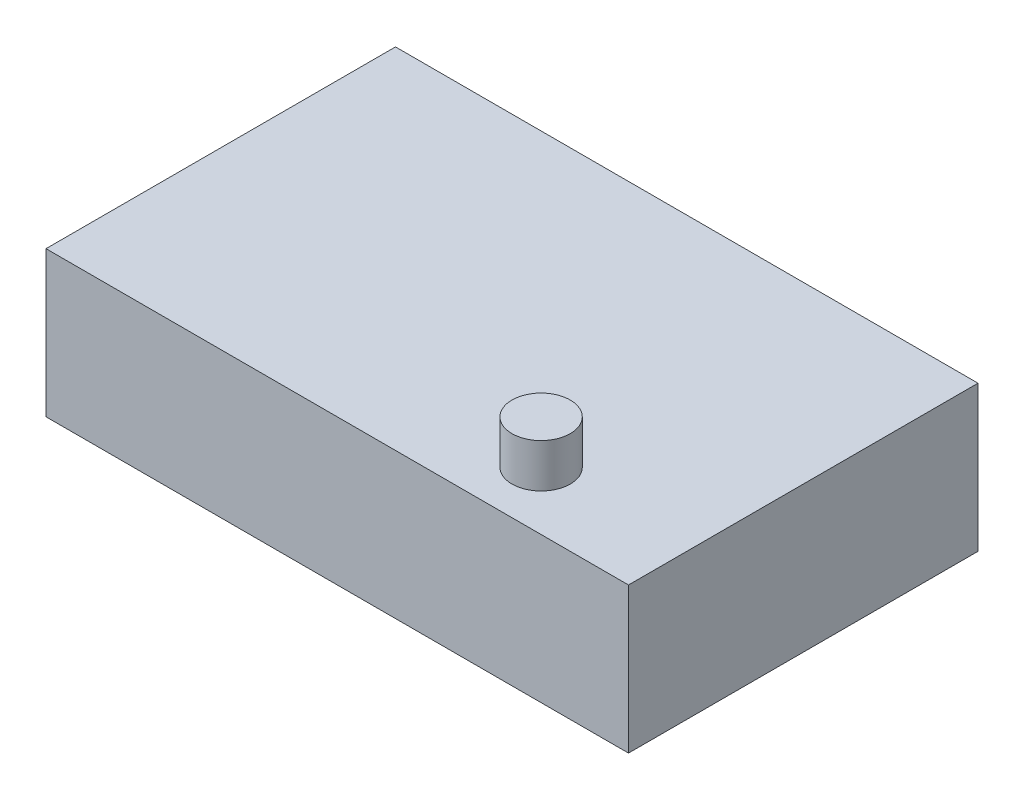
ISO-10303-21;
HEADER;
FILE_DESCRIPTION(('STEP AP214'),'2;1');
FILE_NAME('part.step','',(''),(''),'','','');
FILE_SCHEMA(('AUTOMOTIVE_DESIGN { 1 0 10303 214 1 1 1 1 }'));
ENDSEC;
DATA;
#1=APPLICATION_CONTEXT('core data for automotive mechanical design processes');
#2=APPLICATION_PROTOCOL_DEFINITION('international standard','automotive_design',2000,#1);
#3=PRODUCT_CONTEXT('',#1,'mechanical');
#4=PRODUCT('Part','Part','',(#3));
#5=PRODUCT_RELATED_PRODUCT_CATEGORY('part','',(#4));
#6=PRODUCT_DEFINITION_FORMATION('','',#4);
#7=PRODUCT_DEFINITION_CONTEXT('part definition',#1,'design');
#8=PRODUCT_DEFINITION('design','',#6,#7);
#9=PRODUCT_DEFINITION_SHAPE('','',#8);
#10=(LENGTH_UNIT() NAMED_UNIT(*) SI_UNIT(.MILLI.,.METRE.));
#11=(NAMED_UNIT(*) PLANE_ANGLE_UNIT() SI_UNIT($,.RADIAN.));
#12=(NAMED_UNIT(*) SI_UNIT($,.STERADIAN.) SOLID_ANGLE_UNIT());
#13=UNCERTAINTY_MEASURE_WITH_UNIT(LENGTH_MEASURE(1.E-05),#10,'distance_accuracy_value','');
#14=(GEOMETRIC_REPRESENTATION_CONTEXT(3) GLOBAL_UNCERTAINTY_ASSIGNED_CONTEXT((#13)) GLOBAL_UNIT_ASSIGNED_CONTEXT((#10,
#11,#12)) REPRESENTATION_CONTEXT('',''));
#15=CARTESIAN_POINT('',(0.,0.,0.));
#16=DIRECTION('',(0.,0.,1.));
#17=DIRECTION('',(1.,0.,0.));
#18=AXIS2_PLACEMENT_3D('',#15,#16,#17);
#19=CARTESIAN_POINT('',(-10.,5.,6.));
#20=DIRECTION('',(1.,0.,0.));
#21=DIRECTION('',(0.,0.,-1.));
#22=AXIS2_PLACEMENT_3D('',#19,#20,#21);
#23=PLANE('',#22);
#24=DIRECTION('',(0.,0.,1.));
#25=VECTOR('',#24,1.);
#26=CARTESIAN_POINT('',(-10.,0.,6.));
#27=LINE('',#26,#25);
#28=CARTESIAN_POINT('',(-10.,0.,-6.));
#29=VERTEX_POINT('',#28);
#30=CARTESIAN_POINT('',(-10.,0.,6.));
#31=VERTEX_POINT('',#30);
#32=EDGE_CURVE('E97',#29,#31,#27,.T.);
#33=ORIENTED_EDGE('',*,*,#32,.T.);
#34=DIRECTION('',(0.,-1.,0.));
#35=VECTOR('',#34,1.);
#36=CARTESIAN_POINT('',(-10.,5.,6.));
#37=LINE('',#36,#35);
#38=CARTESIAN_POINT('',(-10.,5.,6.));
#39=VERTEX_POINT('',#38);
#40=EDGE_CURVE('E11',#39,#31,#37,.T.);
#41=ORIENTED_EDGE('',*,*,#40,.F.);
#42=DIRECTION('',(0.,0.,1.));
#43=VECTOR('',#42,1.);
#44=CARTESIAN_POINT('',(-10.,5.,6.));
#45=LINE('',#44,#43);
#46=CARTESIAN_POINT('',(-10.,5.,-6.));
#47=VERTEX_POINT('',#46);
#48=EDGE_CURVE('E85',#47,#39,#45,.T.);
#49=ORIENTED_EDGE('',*,*,#48,.F.);
#50=DIRECTION('',(0.,-1.,0.));
#51=VECTOR('',#50,1.);
#52=CARTESIAN_POINT('',(-10.,5.,-6.));
#53=LINE('',#52,#51);
#54=EDGE_CURVE('E93',#47,#29,#53,.T.);
#55=ORIENTED_EDGE('',*,*,#54,.T.);
#56=EDGE_LOOP('',(#33,#41,#49,#55));
#57=FACE_BOUND('',#56,.T.);
#58=ADVANCED_FACE('F34',(#57),#23,.F.);
#59=CARTESIAN_POINT('',(10.,5.,6.));
#60=DIRECTION('',(0.,0.,-1.));
#61=DIRECTION('',(-1.,0.,0.));
#62=AXIS2_PLACEMENT_3D('',#59,#60,#61);
#63=PLANE('',#62);
#64=DIRECTION('',(1.,0.,0.));
#65=VECTOR('',#64,1.);
#66=CARTESIAN_POINT('',(10.,0.,6.));
#67=LINE('',#66,#65);
#68=CARTESIAN_POINT('',(10.,0.,6.));
#69=VERTEX_POINT('',#68);
#70=EDGE_CURVE('E89',#31,#69,#67,.T.);
#71=ORIENTED_EDGE('',*,*,#70,.T.);
#72=DIRECTION('',(0.,-1.,0.));
#73=VECTOR('',#72,1.);
#74=CARTESIAN_POINT('',(10.,5.,6.));
#75=LINE('',#74,#73);
#76=CARTESIAN_POINT('',(10.,5.,6.));
#77=VERTEX_POINT('',#76);
#78=EDGE_CURVE('E42',#77,#69,#75,.T.);
#79=ORIENTED_EDGE('',*,*,#78,.F.);
#80=DIRECTION('',(1.,0.,0.));
#81=VECTOR('',#80,1.);
#82=CARTESIAN_POINT('',(10.,5.,6.));
#83=LINE('',#82,#81);
#84=EDGE_CURVE('E80',#39,#77,#83,.T.);
#85=ORIENTED_EDGE('',*,*,#84,.F.);
#86=ORIENTED_EDGE('',*,*,#40,.T.);
#87=EDGE_LOOP('',(#71,#79,#85,#86));
#88=FACE_BOUND('',#87,.T.);
#89=ADVANCED_FACE('F88',(#88),#63,.F.);
#90=CARTESIAN_POINT('',(10.,5.,6.));
#91=DIRECTION('',(-1.,0.,0.));
#92=DIRECTION('',(0.,0.,1.));
#93=AXIS2_PLACEMENT_3D('',#90,#91,#92);
#94=PLANE('',#93);
#95=DIRECTION('',(0.,0.,-1.));
#96=VECTOR('',#95,1.);
#97=CARTESIAN_POINT('',(10.,0.,6.));
#98=LINE('',#97,#96);
#99=CARTESIAN_POINT('',(10.,0.,-6.));
#100=VERTEX_POINT('',#99);
#101=EDGE_CURVE('E67',#69,#100,#98,.T.);
#102=ORIENTED_EDGE('',*,*,#101,.T.);
#103=DIRECTION('',(0.,-1.,0.));
#104=VECTOR('',#103,1.);
#105=CARTESIAN_POINT('',(10.,5.,-6.));
#106=LINE('',#105,#104);
#107=CARTESIAN_POINT('',(10.,5.,-6.));
#108=VERTEX_POINT('',#107);
#109=EDGE_CURVE('E90',#108,#100,#106,.T.);
#110=ORIENTED_EDGE('',*,*,#109,.F.);
#111=DIRECTION('',(0.,0.,-1.));
#112=VECTOR('',#111,1.);
#113=CARTESIAN_POINT('',(10.,5.,6.));
#114=LINE('',#113,#112);
#115=EDGE_CURVE('E83',#77,#108,#114,.T.);
#116=ORIENTED_EDGE('',*,*,#115,.F.);
#117=ORIENTED_EDGE('',*,*,#78,.T.);
#118=EDGE_LOOP('',(#102,#110,#116,#117));
#119=FACE_BOUND('',#118,.T.);
#120=ADVANCED_FACE('F91',(#119),#94,.F.);
#121=CARTESIAN_POINT('',(10.,5.,-6.));
#122=DIRECTION('',(0.,0.,1.));
#123=DIRECTION('',(1.,0.,0.));
#124=AXIS2_PLACEMENT_3D('',#121,#122,#123);
#125=PLANE('',#124);
#126=DIRECTION('',(-1.,0.,0.));
#127=VECTOR('',#126,1.);
#128=CARTESIAN_POINT('',(10.,0.,-6.));
#129=LINE('',#128,#127);
#130=EDGE_CURVE('E73',#100,#29,#129,.T.);
#131=ORIENTED_EDGE('',*,*,#130,.T.);
#132=ORIENTED_EDGE('',*,*,#54,.F.);
#133=DIRECTION('',(-1.,0.,0.));
#134=VECTOR('',#133,1.);
#135=CARTESIAN_POINT('',(10.,5.,-6.));
#136=LINE('',#135,#134);
#137=EDGE_CURVE('E50',#108,#47,#136,.T.);
#138=ORIENTED_EDGE('',*,*,#137,.F.);
#139=ORIENTED_EDGE('',*,*,#109,.T.);
#140=EDGE_LOOP('',(#131,#132,#138,#139));
#141=FACE_BOUND('',#140,.T.);
#142=ADVANCED_FACE('F105',(#141),#125,.F.);
#143=CARTESIAN_POINT('',(0.,5.,0.));
#144=DIRECTION('',(0.,1.,0.));
#145=DIRECTION('',(0.,0.,1.));
#146=AXIS2_PLACEMENT_3D('',#143,#144,#145);
#147=PLANE('',#146);
#148=CARTESIAN_POINT('',(5.,5.,4.));
#149=DIRECTION('',(0.,1.,0.));
#150=DIRECTION('',(0.,0.,1.));
#151=AXIS2_PLACEMENT_3D('',#148,#149,#150);
#152=CIRCLE('',#151,1.);
#153=CARTESIAN_POINT('',(5.,5.,5.));
#154=VERTEX_POINT('',#153);
#155=EDGE_CURVE('E111',#154,#154,#152,.T.);
#156=ORIENTED_EDGE('',*,*,#155,.F.);
#157=EDGE_LOOP('',(#156));
#158=FACE_BOUND('',#157,.T.);
#159=ORIENTED_EDGE('',*,*,#48,.T.);
#160=ORIENTED_EDGE('',*,*,#84,.T.);
#161=ORIENTED_EDGE('',*,*,#115,.T.);
#162=ORIENTED_EDGE('',*,*,#137,.T.);
#163=EDGE_LOOP('',(#159,#160,#161,#162));
#164=FACE_BOUND('',#163,.T.);
#165=ADVANCED_FACE('F81',(#158,#164),#147,.T.);
#166=CARTESIAN_POINT('',(0.,0.,0.));
#167=DIRECTION('',(0.,1.,0.));
#168=DIRECTION('',(0.,0.,1.));
#169=AXIS2_PLACEMENT_3D('',#166,#167,#168);
#170=PLANE('',#169);
#171=ORIENTED_EDGE('',*,*,#32,.F.);
#172=ORIENTED_EDGE('',*,*,#130,.F.);
#173=ORIENTED_EDGE('',*,*,#101,.F.);
#174=ORIENTED_EDGE('',*,*,#70,.F.);
#175=EDGE_LOOP('',(#171,#172,#173,#174));
#176=FACE_BOUND('',#175,.T.);
#177=ADVANCED_FACE('F108',(#176),#170,.F.);
#178=CARTESIAN_POINT('',(5.,6.5,4.));
#179=DIRECTION('',(0.,-1.,0.));
#180=DIRECTION('',(0.,0.,-1.));
#181=AXIS2_PLACEMENT_3D('',#178,#179,#180);
#182=CYLINDRICAL_SURFACE('',#181,1.);
#183=CARTESIAN_POINT('',(5.,6.5,4.));
#184=DIRECTION('',(0.,1.,0.));
#185=DIRECTION('',(0.,0.,1.));
#186=AXIS2_PLACEMENT_3D('',#183,#184,#185);
#187=CIRCLE('',#186,1.);
#188=CARTESIAN_POINT('',(5.,6.5,5.));
#189=VERTEX_POINT('',#188);
#190=EDGE_CURVE('E100',#189,#189,#187,.T.);
#191=ORIENTED_EDGE('',*,*,#190,.F.);
#192=EDGE_LOOP('',(#191));
#193=FACE_BOUND('',#192,.T.);
#194=ORIENTED_EDGE('',*,*,#155,.T.);
#195=EDGE_LOOP('',(#194));
#196=FACE_BOUND('',#195,.T.);
#197=ADVANCED_FACE('F119',(#193,#196),#182,.T.);
#198=CARTESIAN_POINT('',(5.,6.5,4.));
#199=DIRECTION('',(0.,1.,0.));
#200=DIRECTION('',(0.,0.,1.));
#201=AXIS2_PLACEMENT_3D('',#198,#199,#200);
#202=PLANE('',#201);
#203=ORIENTED_EDGE('',*,*,#190,.T.);
#204=EDGE_LOOP('',(#203));
#205=FACE_BOUND('',#204,.T.);
#206=ADVANCED_FACE('F117',(#205),#202,.T.);
#207=CLOSED_SHELL('',(#58,#89,#120,#142,#165,#177,#197,#206));
#208=MANIFOLD_SOLID_BREP('B2',#207);
#209=ADVANCED_BREP_SHAPE_REPRESENTATION('',(#18,#208),#14);
#210=SHAPE_DEFINITION_REPRESENTATION(#9,#209);
ENDSEC;
END-ISO-10303-21;
